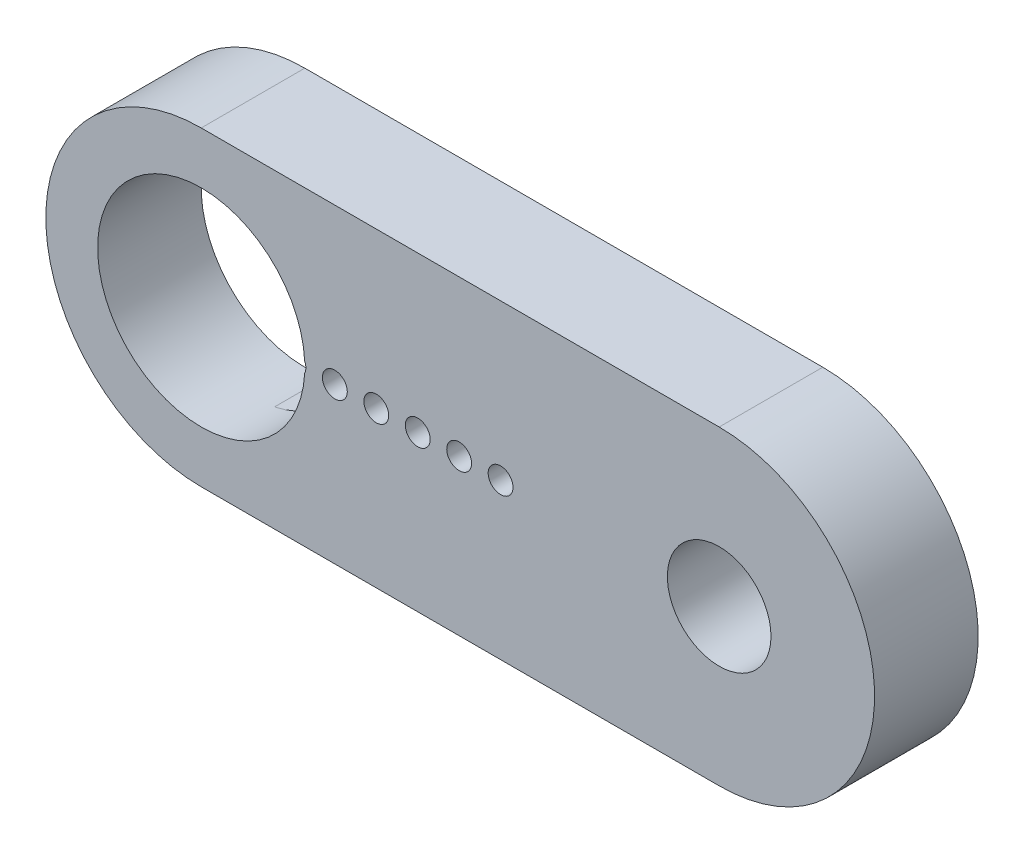
ISO-10303-21;
HEADER;
FILE_DESCRIPTION(('STEP AP214'),'2;1');
FILE_NAME('part.step','',(''),(''),'','','');
FILE_SCHEMA(('AUTOMOTIVE_DESIGN { 1 0 10303 214 1 1 1 1 }'));
ENDSEC;
DATA;
#1=APPLICATION_CONTEXT('core data for automotive mechanical design processes');
#2=APPLICATION_PROTOCOL_DEFINITION('international standard','automotive_design',2000,#1);
#3=PRODUCT_CONTEXT('',#1,'mechanical');
#4=PRODUCT('Part','Part','',(#3));
#5=PRODUCT_RELATED_PRODUCT_CATEGORY('part','',(#4));
#6=PRODUCT_DEFINITION_FORMATION('','',#4);
#7=PRODUCT_DEFINITION_CONTEXT('part definition',#1,'design');
#8=PRODUCT_DEFINITION('design','',#6,#7);
#9=PRODUCT_DEFINITION_SHAPE('','',#8);
#10=(LENGTH_UNIT() NAMED_UNIT(*) SI_UNIT(.MILLI.,.METRE.));
#11=(NAMED_UNIT(*) PLANE_ANGLE_UNIT() SI_UNIT($,.RADIAN.));
#12=(NAMED_UNIT(*) SI_UNIT($,.STERADIAN.) SOLID_ANGLE_UNIT());
#13=UNCERTAINTY_MEASURE_WITH_UNIT(LENGTH_MEASURE(1.E-05),#10,'distance_accuracy_value','');
#14=(GEOMETRIC_REPRESENTATION_CONTEXT(3) GLOBAL_UNCERTAINTY_ASSIGNED_CONTEXT((#13)) GLOBAL_UNIT_ASSIGNED_CONTEXT((#10,
#11,#12)) REPRESENTATION_CONTEXT('',''));
#15=CARTESIAN_POINT('',(0.,0.,0.));
#16=DIRECTION('',(0.,0.,1.));
#17=DIRECTION('',(1.,0.,0.));
#18=AXIS2_PLACEMENT_3D('',#15,#16,#17);
#19=CARTESIAN_POINT('',(0.,0.,5.));
#20=DIRECTION('',(0.,0.,1.));
#21=DIRECTION('',(1.,0.,0.));
#22=AXIS2_PLACEMENT_3D('',#19,#20,#21);
#23=CYLINDRICAL_SURFACE('',#22,5.);
#24=CARTESIAN_POINT('',(0.,0.,0.));
#25=DIRECTION('',(0.,0.,1.));
#26=DIRECTION('',(1.,0.,0.));
#27=AXIS2_PLACEMENT_3D('',#24,#25,#26);
#28=CIRCLE('',#27,5.);
#29=CARTESIAN_POINT('',(1.03806228373702,4.89105578531698,0.));
#30=VERTEX_POINT('',#29);
#31=CARTESIAN_POINT('',(1.03806228373702,-4.89105578531698,0.));
#32=VERTEX_POINT('',#31);
#33=EDGE_CURVE('E123',#30,#32,#28,.T.);
#34=ORIENTED_EDGE('',*,*,#33,.F.);
#35=DIRECTION('',(0.,0.,-1.));
#36=VECTOR('',#35,1.);
#37=CARTESIAN_POINT('',(1.03806228373702,4.89105578531698,2.5));
#38=LINE('',#37,#36);
#39=CARTESIAN_POINT('',(1.03806228373702,4.89105578531698,2.5));
#40=VERTEX_POINT('',#39);
#41=EDGE_CURVE('E258',#40,#30,#38,.T.);
#42=ORIENTED_EDGE('',*,*,#41,.F.);
#43=CARTESIAN_POINT('',(0.,0.,2.5));
#44=DIRECTION('',(0.,0.,-1.));
#45=DIRECTION('',(-1.,0.,0.));
#46=AXIS2_PLACEMENT_3D('',#43,#44,#45);
#47=CIRCLE('',#46,5.);
#48=CARTESIAN_POINT('',(4.9935393258427,0.254096440869344,2.5));
#49=VERTEX_POINT('',#48);
#50=EDGE_CURVE('E241',#49,#40,#47,.F.);
#51=ORIENTED_EDGE('',*,*,#50,.F.);
#52=DIRECTION('',(0.,0.,-1.));
#53=VECTOR('',#52,1.);
#54=CARTESIAN_POINT('',(4.9935393258427,0.254096440869344,5.));
#55=LINE('',#54,#53);
#56=CARTESIAN_POINT('',(4.9935393258427,0.254096440869345,5.));
#57=VERTEX_POINT('',#56);
#58=EDGE_CURVE('E127',#57,#49,#55,.T.);
#59=ORIENTED_EDGE('',*,*,#58,.F.);
#60=CARTESIAN_POINT('',(0.,0.,5.));
#61=DIRECTION('',(0.,0.,1.));
#62=DIRECTION('',(1.,0.,0.));
#63=AXIS2_PLACEMENT_3D('',#60,#61,#62);
#64=CIRCLE('',#63,5.);
#65=CARTESIAN_POINT('',(4.9935393258427,-0.254096440869347,5.));
#66=VERTEX_POINT('',#65);
#67=EDGE_CURVE('E138',#57,#66,#64,.T.);
#68=ORIENTED_EDGE('',*,*,#67,.T.);
#69=DIRECTION('',(0.,0.,-1.));
#70=VECTOR('',#69,1.);
#71=CARTESIAN_POINT('',(4.9935393258427,-0.254096440869346,5.));
#72=LINE('',#71,#70);
#73=CARTESIAN_POINT('',(4.9935393258427,-0.254096440869346,2.5));
#74=VERTEX_POINT('',#73);
#75=EDGE_CURVE('E278',#74,#66,#72,.F.);
#76=ORIENTED_EDGE('',*,*,#75,.F.);
#77=CARTESIAN_POINT('',(0.,0.,2.5));
#78=DIRECTION('',(0.,0.,-1.));
#79=DIRECTION('',(-1.,0.,0.));
#80=AXIS2_PLACEMENT_3D('',#77,#78,#79);
#81=CIRCLE('',#80,5.);
#82=CARTESIAN_POINT('',(1.03806228373702,-4.89105578531698,2.5));
#83=VERTEX_POINT('',#82);
#84=EDGE_CURVE('E52',#83,#74,#81,.F.);
#85=ORIENTED_EDGE('',*,*,#84,.F.);
#86=DIRECTION('',(0.,0.,-1.));
#87=VECTOR('',#86,1.);
#88=CARTESIAN_POINT('',(1.03806228373702,-4.89105578531698,2.5));
#89=LINE('',#88,#87);
#90=EDGE_CURVE('E238',#83,#32,#89,.T.);
#91=ORIENTED_EDGE('',*,*,#90,.T.);
#92=EDGE_LOOP('',(#34,#42,#51,#59,#68,#76,#85,#91));
#93=FACE_BOUND('',#92,.T.);
#94=ADVANCED_FACE('F36',(#93),#23,.F.);
#95=CARTESIAN_POINT('',(0.,0.,0.));
#96=DIRECTION('',(0.,0.,1.));
#97=DIRECTION('',(1.,0.,0.));
#98=AXIS2_PLACEMENT_3D('',#95,#96,#97);
#99=PLANE('',#98);
#100=CARTESIAN_POINT('',(25.,0.,0.));
#101=DIRECTION('',(0.,0.,1.));
#102=DIRECTION('',(1.,0.,0.));
#103=AXIS2_PLACEMENT_3D('',#100,#101,#102);
#104=CIRCLE('',#103,2.5);
#105=CARTESIAN_POINT('',(27.5,0.,0.));
#106=VERTEX_POINT('',#105);
#107=EDGE_CURVE('E132',#106,#106,#104,.T.);
#108=ORIENTED_EDGE('',*,*,#107,.T.);
#109=EDGE_LOOP('',(#108));
#110=FACE_BOUND('',#109,.T.);
#111=CARTESIAN_POINT('',(0.,0.,0.));
#112=DIRECTION('',(0.,0.,1.));
#113=DIRECTION('',(1.,0.,0.));
#114=AXIS2_PLACEMENT_3D('',#111,#112,#113);
#115=CIRCLE('',#114,7.5);
#116=CARTESIAN_POINT('',(0.,7.5,0.));
#117=VERTEX_POINT('',#116);
#118=CARTESIAN_POINT('',(0.,-7.5,0.));
#119=VERTEX_POINT('',#118);
#120=EDGE_CURVE('E126',#117,#119,#115,.T.);
#121=ORIENTED_EDGE('',*,*,#120,.F.);
#122=DIRECTION('',(1.,0.,0.));
#123=VECTOR('',#122,1.);
#124=CARTESIAN_POINT('',(0.,7.5,0.));
#125=LINE('',#124,#123);
#126=CARTESIAN_POINT('',(25.,7.5,0.));
#127=VERTEX_POINT('',#126);
#128=EDGE_CURVE('E130',#127,#117,#125,.F.);
#129=ORIENTED_EDGE('',*,*,#128,.F.);
#130=CARTESIAN_POINT('',(25.,0.,0.));
#131=DIRECTION('',(0.,0.,1.));
#132=DIRECTION('',(1.,0.,0.));
#133=AXIS2_PLACEMENT_3D('',#130,#131,#132);
#134=CIRCLE('',#133,7.5);
#135=CARTESIAN_POINT('',(25.,-7.5,0.));
#136=VERTEX_POINT('',#135);
#137=EDGE_CURVE('E133',#136,#127,#134,.T.);
#138=ORIENTED_EDGE('',*,*,#137,.F.);
#139=DIRECTION('',(1.,0.,0.));
#140=VECTOR('',#139,1.);
#141=CARTESIAN_POINT('',(0.,-7.5,0.));
#142=LINE('',#141,#140);
#143=EDGE_CURVE('E100',#119,#136,#142,.T.);
#144=ORIENTED_EDGE('',*,*,#143,.F.);
#145=EDGE_LOOP('',(#121,#129,#138,#144));
#146=FACE_BOUND('',#145,.T.);
#147=DIRECTION('',(-0.978211157063396,0.207612456747404,0.));
#148=VECTOR('',#147,1.);
#149=CARTESIAN_POINT('',(1.03806228373702,4.89105578531698,0.));
#150=LINE('',#149,#148);
#151=CARTESIAN_POINT('',(14.8652249134948,1.95642231412679,0.));
#152=VERTEX_POINT('',#151);
#153=EDGE_CURVE('E251',#152,#30,#150,.T.);
#154=ORIENTED_EDGE('',*,*,#153,.T.);
#155=ORIENTED_EDGE('',*,*,#33,.T.);
#156=DIRECTION('',(-0.978211157063396,-0.207612456747405,0.));
#157=VECTOR('',#156,1.);
#158=CARTESIAN_POINT('',(1.03806228373702,-4.89105578531698,0.));
#159=LINE('',#158,#157);
#160=CARTESIAN_POINT('',(14.8652249134948,-1.95642231412679,0.));
#161=VERTEX_POINT('',#160);
#162=EDGE_CURVE('E248',#161,#32,#159,.T.);
#163=ORIENTED_EDGE('',*,*,#162,.F.);
#164=CARTESIAN_POINT('',(14.45,0.,0.));
#165=DIRECTION('',(0.,0.,-1.));
#166=DIRECTION('',(-1.,0.,0.));
#167=AXIS2_PLACEMENT_3D('',#164,#165,#166);
#168=CIRCLE('',#167,2.);
#169=EDGE_CURVE('E245',#152,#161,#168,.T.);
#170=ORIENTED_EDGE('',*,*,#169,.F.);
#171=EDGE_LOOP('',(#154,#155,#163,#170));
#172=FACE_BOUND('',#171,.T.);
#173=ADVANCED_FACE('F145',(#110,#146,#172),#99,.F.);
#174=CARTESIAN_POINT('',(14.45,0.,10.));
#175=DIRECTION('',(0.,0.,-1.));
#176=DIRECTION('',(-1.,0.,0.));
#177=AXIS2_PLACEMENT_3D('',#174,#175,#176);
#178=CYLINDRICAL_SURFACE('',#177,0.6);
#179=CARTESIAN_POINT('',(14.45,0.,5.));
#180=DIRECTION('',(0.,0.,1.));
#181=DIRECTION('',(1.,0.,0.));
#182=AXIS2_PLACEMENT_3D('',#179,#180,#181);
#183=CIRCLE('',#182,0.6);
#184=CARTESIAN_POINT('',(15.05,0.,5.));
#185=VERTEX_POINT('',#184);
#186=EDGE_CURVE('E257',#185,#185,#183,.T.);
#187=ORIENTED_EDGE('',*,*,#186,.T.);
#188=EDGE_LOOP('',(#187));
#189=FACE_BOUND('',#188,.T.);
#190=CARTESIAN_POINT('',(14.45,0.,2.5));
#191=DIRECTION('',(0.,0.,-1.));
#192=DIRECTION('',(-1.,0.,0.));
#193=AXIS2_PLACEMENT_3D('',#190,#191,#192);
#194=CIRCLE('',#193,0.6);
#195=CARTESIAN_POINT('',(13.85,0.,2.5));
#196=VERTEX_POINT('',#195);
#197=EDGE_CURVE('E232',#196,#196,#194,.F.);
#198=ORIENTED_EDGE('',*,*,#197,.F.);
#199=EDGE_LOOP('',(#198));
#200=FACE_BOUND('',#199,.T.);
#201=ADVANCED_FACE('F163',(#189,#200),#178,.F.);
#202=CARTESIAN_POINT('',(12.45,0.,10.));
#203=DIRECTION('',(0.,0.,-1.));
#204=DIRECTION('',(-1.,0.,0.));
#205=AXIS2_PLACEMENT_3D('',#202,#203,#204);
#206=CYLINDRICAL_SURFACE('',#205,0.599999999999999);
#207=CARTESIAN_POINT('',(12.45,0.,5.));
#208=DIRECTION('',(0.,0.,1.));
#209=DIRECTION('',(1.,0.,0.));
#210=AXIS2_PLACEMENT_3D('',#207,#208,#209);
#211=CIRCLE('',#210,0.599999999999999);
#212=CARTESIAN_POINT('',(13.05,0.,5.));
#213=VERTEX_POINT('',#212);
#214=EDGE_CURVE('E265',#213,#213,#211,.T.);
#215=ORIENTED_EDGE('',*,*,#214,.T.);
#216=EDGE_LOOP('',(#215));
#217=FACE_BOUND('',#216,.T.);
#218=CARTESIAN_POINT('',(12.45,0.,2.5));
#219=DIRECTION('',(0.,0.,-1.));
#220=DIRECTION('',(-1.,0.,0.));
#221=AXIS2_PLACEMENT_3D('',#218,#219,#220);
#222=CIRCLE('',#221,0.599999999999999);
#223=CARTESIAN_POINT('',(11.85,0.,2.5));
#224=VERTEX_POINT('',#223);
#225=EDGE_CURVE('E212',#224,#224,#222,.F.);
#226=ORIENTED_EDGE('',*,*,#225,.F.);
#227=EDGE_LOOP('',(#226));
#228=FACE_BOUND('',#227,.T.);
#229=ADVANCED_FACE('F174',(#217,#228),#206,.F.);
#230=CARTESIAN_POINT('',(10.45,0.,10.));
#231=DIRECTION('',(0.,0.,-1.));
#232=DIRECTION('',(-1.,0.,0.));
#233=AXIS2_PLACEMENT_3D('',#230,#231,#232);
#234=CYLINDRICAL_SURFACE('',#233,0.6);
#235=CARTESIAN_POINT('',(10.45,0.,5.));
#236=DIRECTION('',(0.,0.,1.));
#237=DIRECTION('',(1.,0.,0.));
#238=AXIS2_PLACEMENT_3D('',#235,#236,#237);
#239=CIRCLE('',#238,0.6);
#240=CARTESIAN_POINT('',(11.05,0.,5.));
#241=VERTEX_POINT('',#240);
#242=EDGE_CURVE('E268',#241,#241,#239,.T.);
#243=ORIENTED_EDGE('',*,*,#242,.T.);
#244=EDGE_LOOP('',(#243));
#245=FACE_BOUND('',#244,.T.);
#246=CARTESIAN_POINT('',(10.45,0.,2.5));
#247=DIRECTION('',(0.,0.,-1.));
#248=DIRECTION('',(-1.,0.,0.));
#249=AXIS2_PLACEMENT_3D('',#246,#247,#248);
#250=CIRCLE('',#249,0.6);
#251=CARTESIAN_POINT('',(9.85,0.,2.5));
#252=VERTEX_POINT('',#251);
#253=EDGE_CURVE('E216',#252,#252,#250,.F.);
#254=ORIENTED_EDGE('',*,*,#253,.F.);
#255=EDGE_LOOP('',(#254));
#256=FACE_BOUND('',#255,.T.);
#257=ADVANCED_FACE('F178',(#245,#256),#234,.F.);
#258=CARTESIAN_POINT('',(8.45,0.,10.));
#259=DIRECTION('',(0.,0.,-1.));
#260=DIRECTION('',(-1.,0.,0.));
#261=AXIS2_PLACEMENT_3D('',#258,#259,#260);
#262=CYLINDRICAL_SURFACE('',#261,0.599999999999999);
#263=CARTESIAN_POINT('',(8.45,0.,5.));
#264=DIRECTION('',(0.,0.,1.));
#265=DIRECTION('',(1.,0.,0.));
#266=AXIS2_PLACEMENT_3D('',#263,#264,#265);
#267=CIRCLE('',#266,0.599999999999999);
#268=CARTESIAN_POINT('',(9.05,0.,5.));
#269=VERTEX_POINT('',#268);
#270=EDGE_CURVE('E271',#269,#269,#267,.T.);
#271=ORIENTED_EDGE('',*,*,#270,.T.);
#272=EDGE_LOOP('',(#271));
#273=FACE_BOUND('',#272,.T.);
#274=CARTESIAN_POINT('',(8.45,0.,2.5));
#275=DIRECTION('',(0.,0.,-1.));
#276=DIRECTION('',(-1.,0.,0.));
#277=AXIS2_PLACEMENT_3D('',#274,#275,#276);
#278=CIRCLE('',#277,0.599999999999999);
#279=CARTESIAN_POINT('',(7.85,0.,2.5));
#280=VERTEX_POINT('',#279);
#281=EDGE_CURVE('E220',#280,#280,#278,.F.);
#282=ORIENTED_EDGE('',*,*,#281,.F.);
#283=EDGE_LOOP('',(#282));
#284=FACE_BOUND('',#283,.T.);
#285=ADVANCED_FACE('F182',(#273,#284),#262,.F.);
#286=CARTESIAN_POINT('',(6.45,0.,10.));
#287=DIRECTION('',(0.,0.,-1.));
#288=DIRECTION('',(-1.,0.,0.));
#289=AXIS2_PLACEMENT_3D('',#286,#287,#288);
#290=CYLINDRICAL_SURFACE('',#289,0.599999999999999);
#291=CARTESIAN_POINT('',(6.45,0.,5.));
#292=DIRECTION('',(0.,0.,1.));
#293=DIRECTION('',(1.,0.,0.));
#294=AXIS2_PLACEMENT_3D('',#291,#292,#293);
#295=CIRCLE('',#294,0.599999999999999);
#296=CARTESIAN_POINT('',(7.05,0.,5.));
#297=VERTEX_POINT('',#296);
#298=EDGE_CURVE('E274',#297,#297,#295,.T.);
#299=ORIENTED_EDGE('',*,*,#298,.T.);
#300=EDGE_LOOP('',(#299));
#301=FACE_BOUND('',#300,.T.);
#302=CARTESIAN_POINT('',(6.45,0.,2.5));
#303=DIRECTION('',(0.,0.,-1.));
#304=DIRECTION('',(-1.,0.,0.));
#305=AXIS2_PLACEMENT_3D('',#302,#303,#304);
#306=CIRCLE('',#305,0.599999999999999);
#307=CARTESIAN_POINT('',(5.85,0.,2.5));
#308=VERTEX_POINT('',#307);
#309=EDGE_CURVE('E223',#308,#308,#306,.F.);
#310=ORIENTED_EDGE('',*,*,#309,.F.);
#311=EDGE_LOOP('',(#310));
#312=FACE_BOUND('',#311,.T.);
#313=ADVANCED_FACE('F186',(#301,#312),#290,.F.);
#314=CARTESIAN_POINT('',(4.45,0.,10.));
#315=DIRECTION('',(0.,0.,-1.));
#316=DIRECTION('',(-1.,0.,0.));
#317=AXIS2_PLACEMENT_3D('',#314,#315,#316);
#318=CYLINDRICAL_SURFACE('',#317,0.6);
#319=CARTESIAN_POINT('',(4.45,0.,2.5));
#320=DIRECTION('',(0.,0.,-1.));
#321=DIRECTION('',(-1.,0.,0.));
#322=AXIS2_PLACEMENT_3D('',#319,#320,#321);
#323=CIRCLE('',#322,0.6);
#324=EDGE_CURVE('E305',#74,#49,#323,.F.);
#325=ORIENTED_EDGE('',*,*,#324,.F.);
#326=ORIENTED_EDGE('',*,*,#75,.T.);
#327=CARTESIAN_POINT('',(4.45,0.,5.));
#328=DIRECTION('',(0.,0.,1.));
#329=DIRECTION('',(1.,0.,0.));
#330=AXIS2_PLACEMENT_3D('',#327,#328,#329);
#331=CIRCLE('',#330,0.6);
#332=EDGE_CURVE('E91',#66,#57,#331,.T.);
#333=ORIENTED_EDGE('',*,*,#332,.T.);
#334=ORIENTED_EDGE('',*,*,#58,.T.);
#335=EDGE_LOOP('',(#325,#326,#333,#334));
#336=FACE_BOUND('',#335,.T.);
#337=ADVANCED_FACE('F155',(#336),#318,.F.);
#338=CARTESIAN_POINT('',(25.,0.,5.));
#339=DIRECTION('',(0.,0.,1.));
#340=DIRECTION('',(1.,0.,0.));
#341=AXIS2_PLACEMENT_3D('',#338,#339,#340);
#342=CYLINDRICAL_SURFACE('',#341,7.5);
#343=DIRECTION('',(0.,0.,1.));
#344=VECTOR('',#343,1.);
#345=CARTESIAN_POINT('',(25.,-7.5,5.));
#346=LINE('',#345,#344);
#347=CARTESIAN_POINT('',(25.,-7.5,5.));
#348=VERTEX_POINT('',#347);
#349=EDGE_CURVE('E11',#136,#348,#346,.T.);
#350=ORIENTED_EDGE('',*,*,#349,.F.);
#351=ORIENTED_EDGE('',*,*,#137,.T.);
#352=DIRECTION('',(0.,0.,1.));
#353=VECTOR('',#352,1.);
#354=CARTESIAN_POINT('',(25.,7.5,5.));
#355=LINE('',#354,#353);
#356=CARTESIAN_POINT('',(25.,7.5,5.));
#357=VERTEX_POINT('',#356);
#358=EDGE_CURVE('E45',#127,#357,#355,.T.);
#359=ORIENTED_EDGE('',*,*,#358,.T.);
#360=CARTESIAN_POINT('',(25.,0.,5.));
#361=DIRECTION('',(0.,0.,1.));
#362=DIRECTION('',(1.,0.,0.));
#363=AXIS2_PLACEMENT_3D('',#360,#361,#362);
#364=CIRCLE('',#363,7.5);
#365=EDGE_CURVE('E111',#348,#357,#364,.T.);
#366=ORIENTED_EDGE('',*,*,#365,.F.);
#367=EDGE_LOOP('',(#350,#351,#359,#366));
#368=FACE_BOUND('',#367,.T.);
#369=ADVANCED_FACE('F114',(#368),#342,.T.);
#370=CARTESIAN_POINT('',(0.,7.5,5.));
#371=DIRECTION('',(0.,1.,0.));
#372=DIRECTION('',(-1.,0.,0.));
#373=AXIS2_PLACEMENT_3D('',#370,#371,#372);
#374=PLANE('',#373);
#375=ORIENTED_EDGE('',*,*,#358,.F.);
#376=ORIENTED_EDGE('',*,*,#128,.T.);
#377=DIRECTION('',(0.,0.,1.));
#378=VECTOR('',#377,1.);
#379=CARTESIAN_POINT('',(0.,7.5,5.));
#380=LINE('',#379,#378);
#381=CARTESIAN_POINT('',(0.,7.5,5.));
#382=VERTEX_POINT('',#381);
#383=EDGE_CURVE('E61',#117,#382,#380,.T.);
#384=ORIENTED_EDGE('',*,*,#383,.T.);
#385=DIRECTION('',(-1.,0.,0.));
#386=VECTOR('',#385,1.);
#387=CARTESIAN_POINT('',(0.,7.5,5.));
#388=LINE('',#387,#386);
#389=EDGE_CURVE('E115',#357,#382,#388,.T.);
#390=ORIENTED_EDGE('',*,*,#389,.F.);
#391=EDGE_LOOP('',(#375,#376,#384,#390));
#392=FACE_BOUND('',#391,.T.);
#393=ADVANCED_FACE('F147',(#392),#374,.T.);
#394=CARTESIAN_POINT('',(0.,0.,5.));
#395=DIRECTION('',(0.,0.,1.));
#396=DIRECTION('',(1.,0.,0.));
#397=AXIS2_PLACEMENT_3D('',#394,#395,#396);
#398=CYLINDRICAL_SURFACE('',#397,7.5);
#399=ORIENTED_EDGE('',*,*,#383,.F.);
#400=ORIENTED_EDGE('',*,*,#120,.T.);
#401=DIRECTION('',(0.,0.,1.));
#402=VECTOR('',#401,1.);
#403=CARTESIAN_POINT('',(0.,-7.5,5.));
#404=LINE('',#403,#402);
#405=CARTESIAN_POINT('',(0.,-7.5,5.));
#406=VERTEX_POINT('',#405);
#407=EDGE_CURVE('E40',#119,#406,#404,.T.);
#408=ORIENTED_EDGE('',*,*,#407,.T.);
#409=CARTESIAN_POINT('',(0.,0.,5.));
#410=DIRECTION('',(0.,0.,1.));
#411=DIRECTION('',(1.,0.,0.));
#412=AXIS2_PLACEMENT_3D('',#409,#410,#411);
#413=CIRCLE('',#412,7.5);
#414=EDGE_CURVE('E112',#382,#406,#413,.T.);
#415=ORIENTED_EDGE('',*,*,#414,.F.);
#416=EDGE_LOOP('',(#399,#400,#408,#415));
#417=FACE_BOUND('',#416,.T.);
#418=ADVANCED_FACE('F141',(#417),#398,.T.);
#419=CARTESIAN_POINT('',(0.,-7.5,5.));
#420=DIRECTION('',(0.,-1.,0.));
#421=DIRECTION('',(1.,0.,0.));
#422=AXIS2_PLACEMENT_3D('',#419,#420,#421);
#423=PLANE('',#422);
#424=ORIENTED_EDGE('',*,*,#143,.T.);
#425=ORIENTED_EDGE('',*,*,#349,.T.);
#426=DIRECTION('',(1.,0.,0.));
#427=VECTOR('',#426,1.);
#428=CARTESIAN_POINT('',(0.,-7.5,5.));
#429=LINE('',#428,#427);
#430=EDGE_CURVE('E99',#406,#348,#429,.T.);
#431=ORIENTED_EDGE('',*,*,#430,.F.);
#432=ORIENTED_EDGE('',*,*,#407,.F.);
#433=EDGE_LOOP('',(#424,#425,#431,#432));
#434=FACE_BOUND('',#433,.T.);
#435=ADVANCED_FACE('F98',(#434),#423,.T.);
#436=CARTESIAN_POINT('',(25.,0.,5.));
#437=DIRECTION('',(0.,0.,1.));
#438=DIRECTION('',(1.,0.,0.));
#439=AXIS2_PLACEMENT_3D('',#436,#437,#438);
#440=CYLINDRICAL_SURFACE('',#439,2.5);
#441=CARTESIAN_POINT('',(25.,0.,5.));
#442=DIRECTION('',(0.,0.,1.));
#443=DIRECTION('',(1.,0.,0.));
#444=AXIS2_PLACEMENT_3D('',#441,#442,#443);
#445=CIRCLE('',#444,2.5);
#446=CARTESIAN_POINT('',(27.5,0.,5.));
#447=VERTEX_POINT('',#446);
#448=EDGE_CURVE('E117',#447,#447,#445,.T.);
#449=ORIENTED_EDGE('',*,*,#448,.T.);
#450=EDGE_LOOP('',(#449));
#451=FACE_BOUND('',#450,.T.);
#452=ORIENTED_EDGE('',*,*,#107,.F.);
#453=EDGE_LOOP('',(#452));
#454=FACE_BOUND('',#453,.T.);
#455=ADVANCED_FACE('F38',(#451,#454),#440,.F.);
#456=CARTESIAN_POINT('',(0.,0.,5.));
#457=DIRECTION('',(0.,0.,1.));
#458=DIRECTION('',(1.,0.,0.));
#459=AXIS2_PLACEMENT_3D('',#456,#457,#458);
#460=PLANE('',#459);
#461=ORIENTED_EDGE('',*,*,#332,.F.);
#462=ORIENTED_EDGE('',*,*,#67,.F.);
#463=EDGE_LOOP('',(#461,#462));
#464=FACE_BOUND('',#463,.T.);
#465=ORIENTED_EDGE('',*,*,#298,.F.);
#466=EDGE_LOOP('',(#465));
#467=FACE_BOUND('',#466,.T.);
#468=ORIENTED_EDGE('',*,*,#270,.F.);
#469=EDGE_LOOP('',(#468));
#470=FACE_BOUND('',#469,.T.);
#471=ORIENTED_EDGE('',*,*,#242,.F.);
#472=EDGE_LOOP('',(#471));
#473=FACE_BOUND('',#472,.T.);
#474=ORIENTED_EDGE('',*,*,#214,.F.);
#475=EDGE_LOOP('',(#474));
#476=FACE_BOUND('',#475,.T.);
#477=ORIENTED_EDGE('',*,*,#186,.F.);
#478=EDGE_LOOP('',(#477));
#479=FACE_BOUND('',#478,.T.);
#480=ORIENTED_EDGE('',*,*,#414,.T.);
#481=ORIENTED_EDGE('',*,*,#430,.T.);
#482=ORIENTED_EDGE('',*,*,#365,.T.);
#483=ORIENTED_EDGE('',*,*,#389,.T.);
#484=EDGE_LOOP('',(#480,#481,#482,#483));
#485=FACE_BOUND('',#484,.T.);
#486=ORIENTED_EDGE('',*,*,#448,.F.);
#487=EDGE_LOOP('',(#486));
#488=FACE_BOUND('',#487,.T.);
#489=ADVANCED_FACE('F108',(#464,#467,#470,#473,#476,#479,#485,#488),#460,.T.);
#490=CARTESIAN_POINT('',(14.45,0.,2.5));
#491=DIRECTION('',(0.,0.,-1.));
#492=DIRECTION('',(-1.,0.,0.));
#493=AXIS2_PLACEMENT_3D('',#490,#491,#492);
#494=CYLINDRICAL_SURFACE('',#493,2.);
#495=ORIENTED_EDGE('',*,*,#169,.T.);
#496=DIRECTION('',(0.,0.,-1.));
#497=VECTOR('',#496,1.);
#498=CARTESIAN_POINT('',(14.8652249134948,-1.95642231412679,2.5));
#499=LINE('',#498,#497);
#500=CARTESIAN_POINT('',(14.8652249134948,-1.95642231412679,2.5));
#501=VERTEX_POINT('',#500);
#502=EDGE_CURVE('E234',#501,#161,#499,.T.);
#503=ORIENTED_EDGE('',*,*,#502,.F.);
#504=CARTESIAN_POINT('',(14.45,0.,2.5));
#505=DIRECTION('',(0.,0.,-1.));
#506=DIRECTION('',(-1.,0.,0.));
#507=AXIS2_PLACEMENT_3D('',#504,#505,#506);
#508=CIRCLE('',#507,2.);
#509=CARTESIAN_POINT('',(14.8652249134948,1.95642231412679,2.5));
#510=VERTEX_POINT('',#509);
#511=EDGE_CURVE('E229',#510,#501,#508,.T.);
#512=ORIENTED_EDGE('',*,*,#511,.F.);
#513=DIRECTION('',(0.,0.,-1.));
#514=VECTOR('',#513,1.);
#515=CARTESIAN_POINT('',(14.8652249134948,1.95642231412679,2.5));
#516=LINE('',#515,#514);
#517=EDGE_CURVE('E254',#510,#152,#516,.T.);
#518=ORIENTED_EDGE('',*,*,#517,.T.);
#519=EDGE_LOOP('',(#495,#503,#512,#518));
#520=FACE_BOUND('',#519,.T.);
#521=ADVANCED_FACE('F170',(#520),#494,.F.);
#522=CARTESIAN_POINT('',(1.03806228373702,4.89105578531698,2.5));
#523=DIRECTION('',(-0.207612456747404,-0.978211157063396,0.));
#524=DIRECTION('',(0.978211157063396,-0.207612456747404,0.));
#525=AXIS2_PLACEMENT_3D('',#522,#523,#524);
#526=PLANE('',#525);
#527=ORIENTED_EDGE('',*,*,#153,.F.);
#528=ORIENTED_EDGE('',*,*,#517,.F.);
#529=DIRECTION('',(-0.978211157063396,0.207612456747404,0.));
#530=VECTOR('',#529,1.);
#531=CARTESIAN_POINT('',(1.03806228373702,4.89105578531698,2.5));
#532=LINE('',#531,#530);
#533=EDGE_CURVE('E235',#510,#40,#532,.T.);
#534=ORIENTED_EDGE('',*,*,#533,.T.);
#535=ORIENTED_EDGE('',*,*,#41,.T.);
#536=EDGE_LOOP('',(#527,#528,#534,#535));
#537=FACE_BOUND('',#536,.T.);
#538=ADVANCED_FACE('F195',(#537),#526,.T.);
#539=CARTESIAN_POINT('',(1.03806228373702,-4.89105578531698,2.5));
#540=DIRECTION('',(0.207612456747405,-0.978211157063396,0.));
#541=DIRECTION('',(0.978211157063395,0.207612456747405,0.));
#542=AXIS2_PLACEMENT_3D('',#539,#540,#541);
#543=PLANE('',#542);
#544=ORIENTED_EDGE('',*,*,#162,.T.);
#545=ORIENTED_EDGE('',*,*,#90,.F.);
#546=DIRECTION('',(-0.978211157063396,-0.207612456747405,0.));
#547=VECTOR('',#546,1.);
#548=CARTESIAN_POINT('',(1.03806228373702,-4.89105578531698,2.5));
#549=LINE('',#548,#547);
#550=EDGE_CURVE('E302',#501,#83,#549,.T.);
#551=ORIENTED_EDGE('',*,*,#550,.F.);
#552=ORIENTED_EDGE('',*,*,#502,.T.);
#553=EDGE_LOOP('',(#544,#545,#551,#552));
#554=FACE_BOUND('',#553,.T.);
#555=ADVANCED_FACE('F197',(#554),#543,.F.);
#556=CARTESIAN_POINT('',(0.,0.,2.5));
#557=DIRECTION('',(0.,0.,-1.));
#558=DIRECTION('',(-1.,0.,0.));
#559=AXIS2_PLACEMENT_3D('',#556,#557,#558);
#560=PLANE('',#559);
#561=ORIENTED_EDGE('',*,*,#225,.T.);
#562=EDGE_LOOP('',(#561));
#563=FACE_BOUND('',#562,.T.);
#564=ORIENTED_EDGE('',*,*,#253,.T.);
#565=EDGE_LOOP('',(#564));
#566=FACE_BOUND('',#565,.T.);
#567=ORIENTED_EDGE('',*,*,#281,.T.);
#568=EDGE_LOOP('',(#567));
#569=FACE_BOUND('',#568,.T.);
#570=ORIENTED_EDGE('',*,*,#309,.T.);
#571=EDGE_LOOP('',(#570));
#572=FACE_BOUND('',#571,.T.);
#573=ORIENTED_EDGE('',*,*,#511,.T.);
#574=ORIENTED_EDGE('',*,*,#550,.T.);
#575=ORIENTED_EDGE('',*,*,#84,.T.);
#576=ORIENTED_EDGE('',*,*,#324,.T.);
#577=ORIENTED_EDGE('',*,*,#50,.T.);
#578=ORIENTED_EDGE('',*,*,#533,.F.);
#579=EDGE_LOOP('',(#573,#574,#575,#576,#577,#578));
#580=FACE_BOUND('',#579,.T.);
#581=ORIENTED_EDGE('',*,*,#197,.T.);
#582=EDGE_LOOP('',(#581));
#583=FACE_BOUND('',#582,.T.);
#584=ADVANCED_FACE('F200',(#563,#566,#569,#572,#580,#583),#560,.T.);
#585=CLOSED_SHELL('',(#94,#173,#201,#229,#257,#285,#313,#337,#369,#393,#418,#435,#455,#489,#521,
#538,#555,#584));
#586=MANIFOLD_SOLID_BREP('B2',#585);
#587=ADVANCED_BREP_SHAPE_REPRESENTATION('',(#18,#586),#14);
#588=SHAPE_DEFINITION_REPRESENTATION(#9,#587);
ENDSEC;
END-ISO-10303-21;
